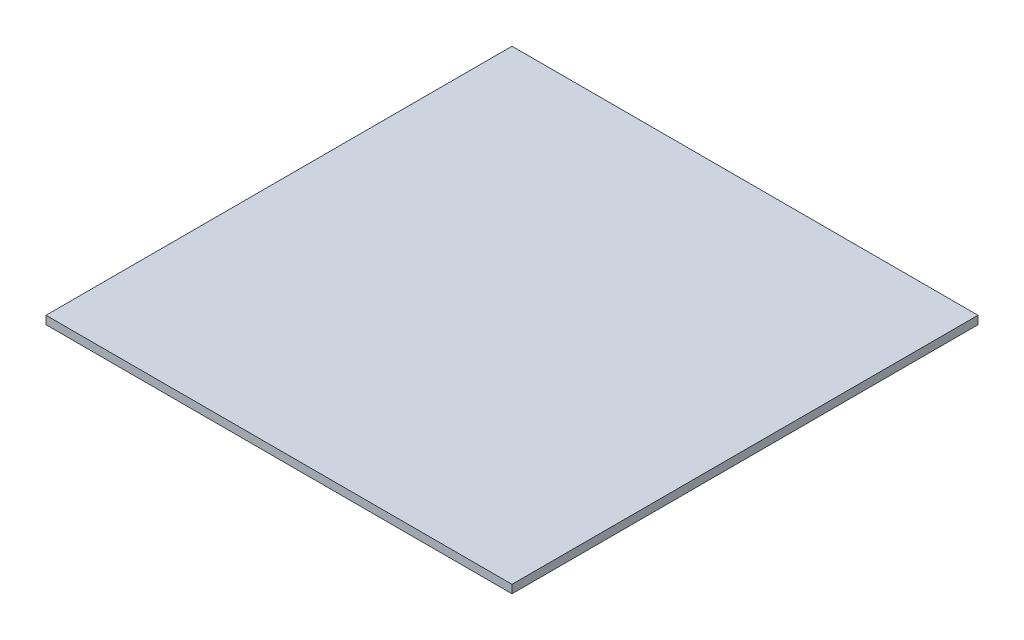
ISO-10303-21;
HEADER;
FILE_DESCRIPTION(('STEP AP214'),'2;1');
FILE_NAME('part.step','',(''),(''),'','','');
FILE_SCHEMA(('AUTOMOTIVE_DESIGN { 1 0 10303 214 1 1 1 1 }'));
ENDSEC;
DATA;
#1=APPLICATION_CONTEXT('core data for automotive mechanical design processes');
#2=APPLICATION_PROTOCOL_DEFINITION('international standard','automotive_design',2000,#1);
#3=PRODUCT_CONTEXT('',#1,'mechanical');
#4=PRODUCT('Part','Part','',(#3));
#5=PRODUCT_RELATED_PRODUCT_CATEGORY('part','',(#4));
#6=PRODUCT_DEFINITION_FORMATION('','',#4);
#7=PRODUCT_DEFINITION_CONTEXT('part definition',#1,'design');
#8=PRODUCT_DEFINITION('design','',#6,#7);
#9=PRODUCT_DEFINITION_SHAPE('','',#8);
#10=(LENGTH_UNIT() NAMED_UNIT(*) SI_UNIT(.MILLI.,.METRE.));
#11=(NAMED_UNIT(*) PLANE_ANGLE_UNIT() SI_UNIT($,.RADIAN.));
#12=(NAMED_UNIT(*) SI_UNIT($,.STERADIAN.) SOLID_ANGLE_UNIT());
#13=UNCERTAINTY_MEASURE_WITH_UNIT(LENGTH_MEASURE(1.E-05),#10,'distance_accuracy_value','');
#14=(GEOMETRIC_REPRESENTATION_CONTEXT(3) GLOBAL_UNCERTAINTY_ASSIGNED_CONTEXT((#13)) GLOBAL_UNIT_ASSIGNED_CONTEXT((#10,
#11,#12)) REPRESENTATION_CONTEXT('',''));
#15=CARTESIAN_POINT('',(0.,0.,0.));
#16=DIRECTION('',(0.,0.,1.));
#17=DIRECTION('',(1.,0.,0.));
#18=AXIS2_PLACEMENT_3D('',#15,#16,#17);
#19=CARTESIAN_POINT('',(-85.,3.,85.));
#20=DIRECTION('',(1.,0.,0.));
#21=DIRECTION('',(0.,0.,-1.));
#22=AXIS2_PLACEMENT_3D('',#19,#20,#21);
#23=PLANE('',#22);
#24=DIRECTION('',(0.,0.,1.));
#25=VECTOR('',#24,1.);
#26=CARTESIAN_POINT('',(-85.,0.,85.));
#27=LINE('',#26,#25);
#28=CARTESIAN_POINT('',(-85.,0.,-85.));
#29=VERTEX_POINT('',#28);
#30=CARTESIAN_POINT('',(-85.,0.,85.));
#31=VERTEX_POINT('',#30);
#32=EDGE_CURVE('E96',#29,#31,#27,.T.);
#33=ORIENTED_EDGE('',*,*,#32,.T.);
#34=DIRECTION('',(0.,-1.,0.));
#35=VECTOR('',#34,1.);
#36=CARTESIAN_POINT('',(-85.,3.,85.));
#37=LINE('',#36,#35);
#38=CARTESIAN_POINT('',(-85.,3.,85.));
#39=VERTEX_POINT('',#38);
#40=EDGE_CURVE('E11',#39,#31,#37,.T.);
#41=ORIENTED_EDGE('',*,*,#40,.F.);
#42=DIRECTION('',(0.,0.,1.));
#43=VECTOR('',#42,1.);
#44=CARTESIAN_POINT('',(-85.,3.,85.));
#45=LINE('',#44,#43);
#46=CARTESIAN_POINT('',(-85.,3.,-85.));
#47=VERTEX_POINT('',#46);
#48=EDGE_CURVE('E84',#47,#39,#45,.T.);
#49=ORIENTED_EDGE('',*,*,#48,.F.);
#50=DIRECTION('',(0.,-1.,0.));
#51=VECTOR('',#50,1.);
#52=CARTESIAN_POINT('',(-85.,3.,-85.));
#53=LINE('',#52,#51);
#54=EDGE_CURVE('E92',#47,#29,#53,.T.);
#55=ORIENTED_EDGE('',*,*,#54,.T.);
#56=EDGE_LOOP('',(#33,#41,#49,#55));
#57=FACE_BOUND('',#56,.T.);
#58=ADVANCED_FACE('F33',(#57),#23,.F.);
#59=CARTESIAN_POINT('',(85.,3.,85.));
#60=DIRECTION('',(0.,0.,-1.));
#61=DIRECTION('',(-1.,0.,0.));
#62=AXIS2_PLACEMENT_3D('',#59,#60,#61);
#63=PLANE('',#62);
#64=DIRECTION('',(1.,0.,0.));
#65=VECTOR('',#64,1.);
#66=CARTESIAN_POINT('',(85.,0.,85.));
#67=LINE('',#66,#65);
#68=CARTESIAN_POINT('',(85.,0.,85.));
#69=VERTEX_POINT('',#68);
#70=EDGE_CURVE('E88',#31,#69,#67,.T.);
#71=ORIENTED_EDGE('',*,*,#70,.T.);
#72=DIRECTION('',(0.,-1.,0.));
#73=VECTOR('',#72,1.);
#74=CARTESIAN_POINT('',(85.,3.,85.));
#75=LINE('',#74,#73);
#76=CARTESIAN_POINT('',(85.,3.,85.));
#77=VERTEX_POINT('',#76);
#78=EDGE_CURVE('E41',#77,#69,#75,.T.);
#79=ORIENTED_EDGE('',*,*,#78,.F.);
#80=DIRECTION('',(1.,0.,0.));
#81=VECTOR('',#80,1.);
#82=CARTESIAN_POINT('',(85.,3.,85.));
#83=LINE('',#82,#81);
#84=EDGE_CURVE('E79',#39,#77,#83,.T.);
#85=ORIENTED_EDGE('',*,*,#84,.F.);
#86=ORIENTED_EDGE('',*,*,#40,.T.);
#87=EDGE_LOOP('',(#71,#79,#85,#86));
#88=FACE_BOUND('',#87,.T.);
#89=ADVANCED_FACE('F87',(#88),#63,.F.);
#90=CARTESIAN_POINT('',(85.,3.,85.));
#91=DIRECTION('',(-1.,0.,0.));
#92=DIRECTION('',(0.,0.,1.));
#93=AXIS2_PLACEMENT_3D('',#90,#91,#92);
#94=PLANE('',#93);
#95=DIRECTION('',(0.,0.,-1.));
#96=VECTOR('',#95,1.);
#97=CARTESIAN_POINT('',(85.,0.,85.));
#98=LINE('',#97,#96);
#99=CARTESIAN_POINT('',(85.,0.,-85.));
#100=VERTEX_POINT('',#99);
#101=EDGE_CURVE('E66',#69,#100,#98,.T.);
#102=ORIENTED_EDGE('',*,*,#101,.T.);
#103=DIRECTION('',(0.,-1.,0.));
#104=VECTOR('',#103,1.);
#105=CARTESIAN_POINT('',(85.,3.,-85.));
#106=LINE('',#105,#104);
#107=CARTESIAN_POINT('',(85.,3.,-85.));
#108=VERTEX_POINT('',#107);
#109=EDGE_CURVE('E89',#108,#100,#106,.T.);
#110=ORIENTED_EDGE('',*,*,#109,.F.);
#111=DIRECTION('',(0.,0.,-1.));
#112=VECTOR('',#111,1.);
#113=CARTESIAN_POINT('',(85.,3.,85.));
#114=LINE('',#113,#112);
#115=EDGE_CURVE('E82',#77,#108,#114,.T.);
#116=ORIENTED_EDGE('',*,*,#115,.F.);
#117=ORIENTED_EDGE('',*,*,#78,.T.);
#118=EDGE_LOOP('',(#102,#110,#116,#117));
#119=FACE_BOUND('',#118,.T.);
#120=ADVANCED_FACE('F90',(#119),#94,.F.);
#121=CARTESIAN_POINT('',(85.,3.,-85.));
#122=DIRECTION('',(0.,0.,1.));
#123=DIRECTION('',(1.,0.,0.));
#124=AXIS2_PLACEMENT_3D('',#121,#122,#123);
#125=PLANE('',#124);
#126=DIRECTION('',(-1.,0.,0.));
#127=VECTOR('',#126,1.);
#128=CARTESIAN_POINT('',(85.,0.,-85.));
#129=LINE('',#128,#127);
#130=EDGE_CURVE('E72',#100,#29,#129,.T.);
#131=ORIENTED_EDGE('',*,*,#130,.T.);
#132=ORIENTED_EDGE('',*,*,#54,.F.);
#133=DIRECTION('',(-1.,0.,0.));
#134=VECTOR('',#133,1.);
#135=CARTESIAN_POINT('',(85.,3.,-85.));
#136=LINE('',#135,#134);
#137=EDGE_CURVE('E49',#108,#47,#136,.T.);
#138=ORIENTED_EDGE('',*,*,#137,.F.);
#139=ORIENTED_EDGE('',*,*,#109,.T.);
#140=EDGE_LOOP('',(#131,#132,#138,#139));
#141=FACE_BOUND('',#140,.T.);
#142=ADVANCED_FACE('F103',(#141),#125,.F.);
#143=CARTESIAN_POINT('',(0.,3.,0.));
#144=DIRECTION('',(0.,1.,0.));
#145=DIRECTION('',(0.,0.,1.));
#146=AXIS2_PLACEMENT_3D('',#143,#144,#145);
#147=PLANE('',#146);
#148=ORIENTED_EDGE('',*,*,#48,.T.);
#149=ORIENTED_EDGE('',*,*,#84,.T.);
#150=ORIENTED_EDGE('',*,*,#115,.T.);
#151=ORIENTED_EDGE('',*,*,#137,.T.);
#152=EDGE_LOOP('',(#148,#149,#150,#151));
#153=FACE_BOUND('',#152,.T.);
#154=ADVANCED_FACE('F80',(#153),#147,.T.);
#155=CARTESIAN_POINT('',(0.,0.,0.));
#156=DIRECTION('',(0.,1.,0.));
#157=DIRECTION('',(0.,0.,1.));
#158=AXIS2_PLACEMENT_3D('',#155,#156,#157);
#159=PLANE('',#158);
#160=ORIENTED_EDGE('',*,*,#32,.F.);
#161=ORIENTED_EDGE('',*,*,#130,.F.);
#162=ORIENTED_EDGE('',*,*,#101,.F.);
#163=ORIENTED_EDGE('',*,*,#70,.F.);
#164=EDGE_LOOP('',(#160,#161,#162,#163));
#165=FACE_BOUND('',#164,.T.);
#166=ADVANCED_FACE('F106',(#165),#159,.F.);
#167=CLOSED_SHELL('',(#58,#89,#120,#142,#154,#166));
#168=MANIFOLD_SOLID_BREP('B2',#167);
#169=ADVANCED_BREP_SHAPE_REPRESENTATION('',(#18,#168),#14);
#170=SHAPE_DEFINITION_REPRESENTATION(#9,#169);
ENDSEC;
END-ISO-10303-21;
